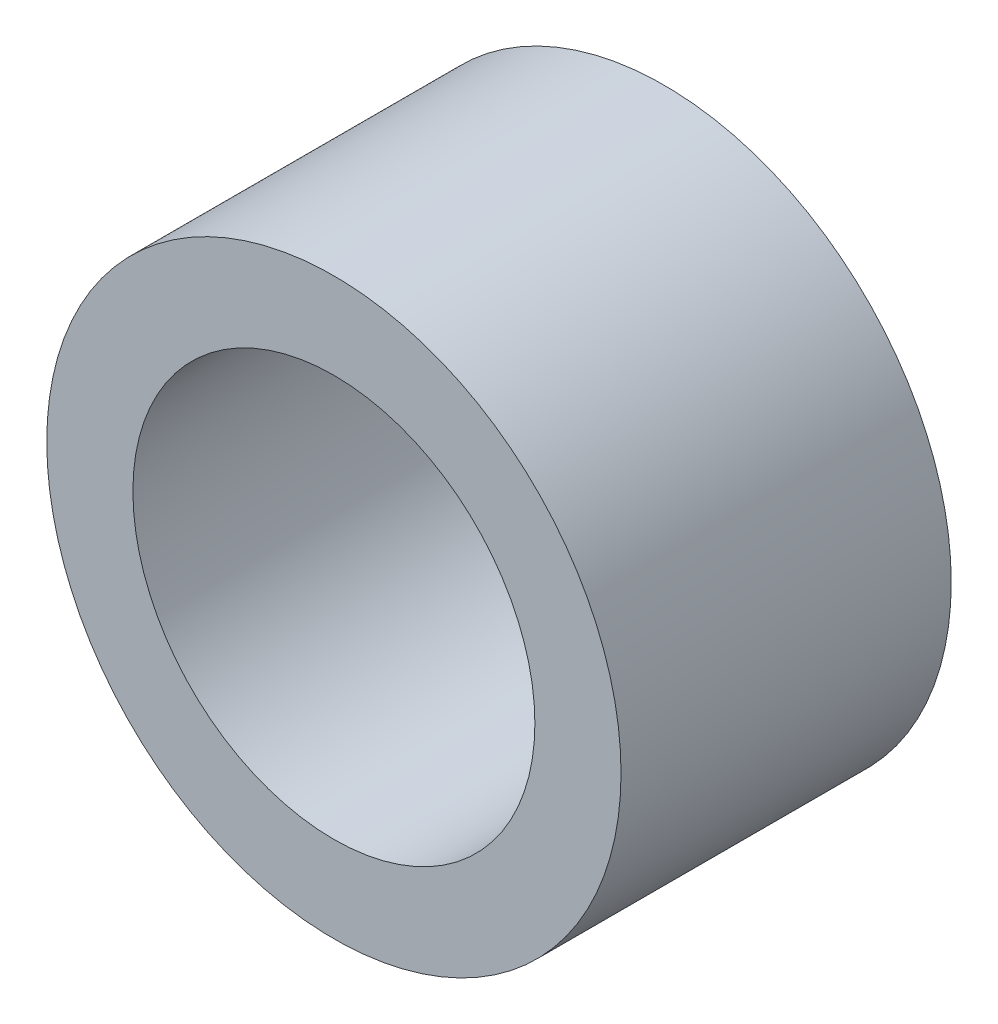
ISO-10303-21;
HEADER;
FILE_DESCRIPTION(('STEP AP214'),'2;1');
FILE_NAME('part.step','',(''),(''),'','','');
FILE_SCHEMA(('AUTOMOTIVE_DESIGN { 1 0 10303 214 1 1 1 1 }'));
ENDSEC;
DATA;
#1=APPLICATION_CONTEXT('core data for automotive mechanical design processes');
#2=APPLICATION_PROTOCOL_DEFINITION('international standard','automotive_design',2000,#1);
#3=PRODUCT_CONTEXT('',#1,'mechanical');
#4=PRODUCT('Part','Part','',(#3));
#5=PRODUCT_RELATED_PRODUCT_CATEGORY('part','',(#4));
#6=PRODUCT_DEFINITION_FORMATION('','',#4);
#7=PRODUCT_DEFINITION_CONTEXT('part definition',#1,'design');
#8=PRODUCT_DEFINITION('design','',#6,#7);
#9=PRODUCT_DEFINITION_SHAPE('','',#8);
#10=(LENGTH_UNIT() NAMED_UNIT(*) SI_UNIT(.MILLI.,.METRE.));
#11=(NAMED_UNIT(*) PLANE_ANGLE_UNIT() SI_UNIT($,.RADIAN.));
#12=(NAMED_UNIT(*) SI_UNIT($,.STERADIAN.) SOLID_ANGLE_UNIT());
#13=UNCERTAINTY_MEASURE_WITH_UNIT(LENGTH_MEASURE(1.E-05),#10,'distance_accuracy_value','');
#14=(GEOMETRIC_REPRESENTATION_CONTEXT(3) GLOBAL_UNCERTAINTY_ASSIGNED_CONTEXT((#13)) GLOBAL_UNIT_ASSIGNED_CONTEXT((#10,
#11,#12)) REPRESENTATION_CONTEXT('',''));
#15=CARTESIAN_POINT('',(0.,0.,0.));
#16=DIRECTION('',(0.,0.,1.));
#17=DIRECTION('',(1.,0.,0.));
#18=AXIS2_PLACEMENT_3D('',#15,#16,#17);
#19=CARTESIAN_POINT('',(23.993,16.8,5.749999994));
#20=DIRECTION('',(0.,0.,1.));
#21=DIRECTION('',(1.,0.,0.));
#22=AXIS2_PLACEMENT_3D('',#19,#20,#21);
#23=PLANE('',#22);
#24=CARTESIAN_POINT('',(23.993,16.8,5.749999994));
#25=DIRECTION('',(0.,0.,1.));
#26=DIRECTION('',(1.,0.,0.));
#27=AXIS2_PLACEMENT_3D('',#24,#25,#26);
#28=CIRCLE('',#27,10.);
#29=CARTESIAN_POINT('',(33.993,16.8,5.749999994));
#30=VERTEX_POINT('',#29);
#31=EDGE_CURVE('E10',#30,#30,#28,.T.);
#32=ORIENTED_EDGE('',*,*,#31,.T.);
#33=EDGE_LOOP('',(#32));
#34=FACE_BOUND('',#33,.T.);
#35=CARTESIAN_POINT('',(23.993,16.8,5.749999994));
#36=DIRECTION('',(0.,0.,1.));
#37=DIRECTION('',(1.,0.,0.));
#38=AXIS2_PLACEMENT_3D('',#35,#36,#37);
#39=CIRCLE('',#38,7.);
#40=CARTESIAN_POINT('',(30.993,16.8,5.749999994));
#41=VERTEX_POINT('',#40);
#42=EDGE_CURVE('E48',#41,#41,#39,.T.);
#43=ORIENTED_EDGE('',*,*,#42,.F.);
#44=EDGE_LOOP('',(#43));
#45=FACE_BOUND('',#44,.T.);
#46=ADVANCED_FACE('F37',(#34,#45),#23,.T.);
#47=CARTESIAN_POINT('',(23.993,16.8,-5.749999994));
#48=DIRECTION('',(0.,0.,1.));
#49=DIRECTION('',(1.,0.,0.));
#50=AXIS2_PLACEMENT_3D('',#47,#48,#49);
#51=PLANE('',#50);
#52=CARTESIAN_POINT('',(23.993,16.8,-5.749999994));
#53=DIRECTION('',(0.,0.,1.));
#54=DIRECTION('',(1.,0.,0.));
#55=AXIS2_PLACEMENT_3D('',#52,#53,#54);
#56=CIRCLE('',#55,10.);
#57=CARTESIAN_POINT('',(33.993,16.8,-5.749999994));
#58=VERTEX_POINT('',#57);
#59=EDGE_CURVE('E41',#58,#58,#56,.T.);
#60=ORIENTED_EDGE('',*,*,#59,.F.);
#61=EDGE_LOOP('',(#60));
#62=FACE_BOUND('',#61,.T.);
#63=CARTESIAN_POINT('',(23.993,16.8,-5.749999994));
#64=DIRECTION('',(0.,0.,1.));
#65=DIRECTION('',(1.,0.,0.));
#66=AXIS2_PLACEMENT_3D('',#63,#64,#65);
#67=CIRCLE('',#66,7.);
#68=CARTESIAN_POINT('',(30.993,16.8,-5.749999994));
#69=VERTEX_POINT('',#68);
#70=EDGE_CURVE('E50',#69,#69,#67,.T.);
#71=ORIENTED_EDGE('',*,*,#70,.T.);
#72=EDGE_LOOP('',(#71));
#73=FACE_BOUND('',#72,.T.);
#74=ADVANCED_FACE('F60',(#62,#73),#51,.F.);
#75=CARTESIAN_POINT('',(23.993,16.8,5.749999994));
#76=DIRECTION('',(0.,0.,-1.));
#77=DIRECTION('',(-1.,0.,0.));
#78=AXIS2_PLACEMENT_3D('',#75,#76,#77);
#79=CYLINDRICAL_SURFACE('',#78,10.);
#80=ORIENTED_EDGE('',*,*,#31,.F.);
#81=EDGE_LOOP('',(#80));
#82=FACE_BOUND('',#81,.T.);
#83=ORIENTED_EDGE('',*,*,#59,.T.);
#84=EDGE_LOOP('',(#83));
#85=FACE_BOUND('',#84,.T.);
#86=ADVANCED_FACE('F39',(#82,#85),#79,.T.);
#87=CARTESIAN_POINT('',(23.993,16.8,5.749999994));
#88=DIRECTION('',(0.,0.,-1.));
#89=DIRECTION('',(-1.,0.,0.));
#90=AXIS2_PLACEMENT_3D('',#87,#88,#89);
#91=CYLINDRICAL_SURFACE('',#90,7.);
#92=ORIENTED_EDGE('',*,*,#42,.T.);
#93=EDGE_LOOP('',(#92));
#94=FACE_BOUND('',#93,.T.);
#95=ORIENTED_EDGE('',*,*,#70,.F.);
#96=EDGE_LOOP('',(#95));
#97=FACE_BOUND('',#96,.T.);
#98=ADVANCED_FACE('F56',(#94,#97),#91,.F.);
#99=CLOSED_SHELL('',(#46,#74,#86,#98));
#100=MANIFOLD_SOLID_BREP('B2',#99);
#101=ADVANCED_BREP_SHAPE_REPRESENTATION('',(#18,#100),#14);
#102=SHAPE_DEFINITION_REPRESENTATION(#9,#101);
ENDSEC;
END-ISO-10303-21;
